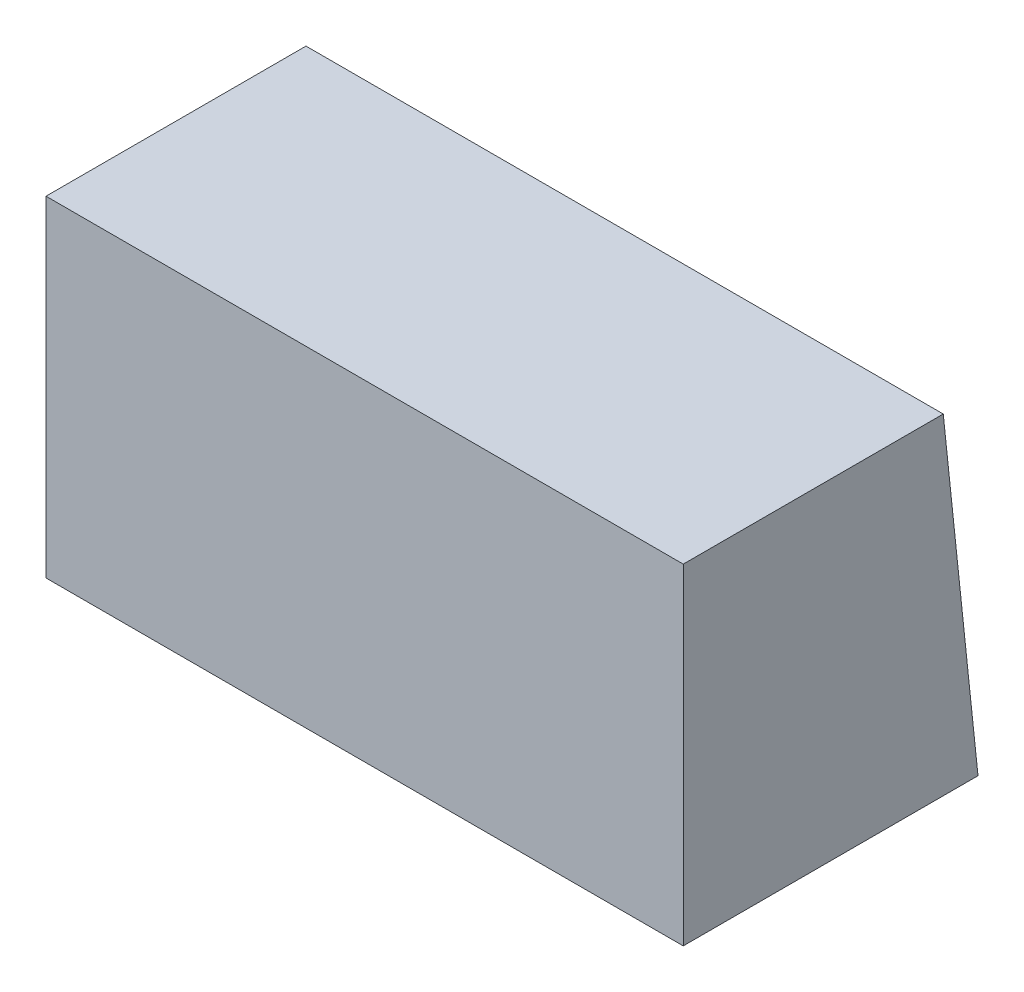
ISO-10303-21;
HEADER;
FILE_DESCRIPTION(('STEP AP214'),'2;1');
FILE_NAME('part.step','',(''),(''),'','','');
FILE_SCHEMA(('AUTOMOTIVE_DESIGN { 1 0 10303 214 1 1 1 1 }'));
ENDSEC;
DATA;
#1=APPLICATION_CONTEXT('core data for automotive mechanical design processes');
#2=APPLICATION_PROTOCOL_DEFINITION('international standard','automotive_design',2000,#1);
#3=PRODUCT_CONTEXT('',#1,'mechanical');
#4=PRODUCT('Part','Part','',(#3));
#5=PRODUCT_RELATED_PRODUCT_CATEGORY('part','',(#4));
#6=PRODUCT_DEFINITION_FORMATION('','',#4);
#7=PRODUCT_DEFINITION_CONTEXT('part definition',#1,'design');
#8=PRODUCT_DEFINITION('design','',#6,#7);
#9=PRODUCT_DEFINITION_SHAPE('','',#8);
#10=(LENGTH_UNIT() NAMED_UNIT(*) SI_UNIT(.MILLI.,.METRE.));
#11=(NAMED_UNIT(*) PLANE_ANGLE_UNIT() SI_UNIT($,.RADIAN.));
#12=(NAMED_UNIT(*) SI_UNIT($,.STERADIAN.) SOLID_ANGLE_UNIT());
#13=UNCERTAINTY_MEASURE_WITH_UNIT(LENGTH_MEASURE(1.E-05),#10,'distance_accuracy_value','');
#14=(GEOMETRIC_REPRESENTATION_CONTEXT(3) GLOBAL_UNCERTAINTY_ASSIGNED_CONTEXT((#13)) GLOBAL_UNIT_ASSIGNED_CONTEXT((#10,
#11,#12)) REPRESENTATION_CONTEXT('',''));
#15=CARTESIAN_POINT('',(0.,0.,0.));
#16=DIRECTION('',(0.,0.,1.));
#17=DIRECTION('',(1.,0.,0.));
#18=AXIS2_PLACEMENT_3D('',#15,#16,#17);
#19=CARTESIAN_POINT('',(-57.5,66.7726229351717,58.080972831492));
#20=DIRECTION('',(-1.,0.,0.));
#21=DIRECTION('',(0.,-1.,0.));
#22=AXIS2_PLACEMENT_3D('',#19,#20,#21);
#23=PLANE('',#22);
#24=DIRECTION('',(0.,-1.,0.));
#25=VECTOR('',#24,1.);
#26=CARTESIAN_POINT('',(-57.5,105.801666725908,105.));
#27=LINE('',#26,#25);
#28=CARTESIAN_POINT('',(-57.5,66.7726229351717,105.));
#29=VERTEX_POINT('',#28);
#30=CARTESIAN_POINT('',(-57.5,7.10130921307532,105.));
#31=VERTEX_POINT('',#30);
#32=EDGE_CURVE('E115',#29,#31,#27,.T.);
#33=ORIENTED_EDGE('',*,*,#32,.F.);
#34=DIRECTION('',(0.,0.,1.));
#35=VECTOR('',#34,1.);
#36=CARTESIAN_POINT('',(-57.5,66.7726229351717,58.080972831492));
#37=LINE('',#36,#35);
#38=CARTESIAN_POINT('',(-57.5,66.7726229351717,58.080972831492));
#39=VERTEX_POINT('',#38);
#40=EDGE_CURVE('E83',#39,#29,#37,.T.);
#41=ORIENTED_EDGE('',*,*,#40,.F.);
#42=DIRECTION('',(0.,-0.994521895368273,-0.104528463267654));
#43=VECTOR('',#42,1.);
#44=CARTESIAN_POINT('',(-57.5,66.7726229351717,58.080972831492));
#45=LINE('',#44,#43);
#46=CARTESIAN_POINT('',(-57.5,7.10130921307533,51.8092650354328));
#47=VERTEX_POINT('',#46);
#48=EDGE_CURVE('E110',#39,#47,#45,.T.);
#49=ORIENTED_EDGE('',*,*,#48,.T.);
#50=DIRECTION('',(0.,0.,1.));
#51=VECTOR('',#50,1.);
#52=CARTESIAN_POINT('',(-57.5,7.10130921307533,51.8092650354328));
#53=LINE('',#52,#51);
#54=EDGE_CURVE('E78',#47,#31,#53,.T.);
#55=ORIENTED_EDGE('',*,*,#54,.T.);
#56=EDGE_LOOP('',(#33,#41,#49,#55));
#57=FACE_BOUND('',#56,.T.);
#58=ADVANCED_FACE('F44',(#57),#23,.T.);
#59=CARTESIAN_POINT('',(57.5,66.7726229351717,58.080972831492));
#60=DIRECTION('',(0.,1.,0.));
#61=DIRECTION('',(-1.,0.,0.));
#62=AXIS2_PLACEMENT_3D('',#59,#60,#61);
#63=PLANE('',#62);
#64=DIRECTION('',(-1.,0.,0.));
#65=VECTOR('',#64,1.);
#66=CARTESIAN_POINT('',(-150.,66.7726229351717,105.));
#67=LINE('',#66,#65);
#68=CARTESIAN_POINT('',(57.5,66.7726229351717,105.));
#69=VERTEX_POINT('',#68);
#70=EDGE_CURVE('E48',#69,#29,#67,.T.);
#71=ORIENTED_EDGE('',*,*,#70,.F.);
#72=DIRECTION('',(0.,0.,1.));
#73=VECTOR('',#72,1.);
#74=CARTESIAN_POINT('',(57.5,66.7726229351717,58.080972831492));
#75=LINE('',#74,#73);
#76=CARTESIAN_POINT('',(57.5,66.7726229351717,58.080972831492));
#77=VERTEX_POINT('',#76);
#78=EDGE_CURVE('E11',#77,#69,#75,.T.);
#79=ORIENTED_EDGE('',*,*,#78,.F.);
#80=DIRECTION('',(-1.,0.,0.));
#81=VECTOR('',#80,1.);
#82=CARTESIAN_POINT('',(57.5,66.7726229351717,58.080972831492));
#83=LINE('',#82,#81);
#84=EDGE_CURVE('E55',#77,#39,#83,.T.);
#85=ORIENTED_EDGE('',*,*,#84,.T.);
#86=ORIENTED_EDGE('',*,*,#40,.T.);
#87=EDGE_LOOP('',(#71,#79,#85,#86));
#88=FACE_BOUND('',#87,.T.);
#89=ADVANCED_FACE('F126',(#88),#63,.T.);
#90=CARTESIAN_POINT('',(0.,-5.30828562465272,50.5049640600565));
#91=DIRECTION('',(0.,-0.104528463267654,0.994521895368273));
#92=DIRECTION('',(0.,-0.994521895368273,-0.104528463267654));
#93=AXIS2_PLACEMENT_3D('',#90,#91,#92);
#94=PLANE('',#93);
#95=ORIENTED_EDGE('',*,*,#84,.F.);
#96=DIRECTION('',(0.,0.994521895368273,0.104528463267654));
#97=VECTOR('',#96,1.);
#98=CARTESIAN_POINT('',(57.5,7.10130921307533,51.8092650354328));
#99=LINE('',#98,#97);
#100=CARTESIAN_POINT('',(57.5,7.10130921307533,51.8092650354328));
#101=VERTEX_POINT('',#100);
#102=EDGE_CURVE('E96',#101,#77,#99,.T.);
#103=ORIENTED_EDGE('',*,*,#102,.F.);
#104=DIRECTION('',(1.,0.,0.));
#105=VECTOR('',#104,1.);
#106=CARTESIAN_POINT('',(-57.5,7.10130921307533,51.8092650354328));
#107=LINE('',#106,#105);
#108=EDGE_CURVE('E105',#47,#101,#107,.T.);
#109=ORIENTED_EDGE('',*,*,#108,.F.);
#110=ORIENTED_EDGE('',*,*,#48,.F.);
#111=EDGE_LOOP('',(#95,#103,#109,#110));
#112=FACE_BOUND('',#111,.T.);
#113=ADVANCED_FACE('F103',(#112),#94,.F.);
#114=CARTESIAN_POINT('',(-57.5,7.10130921307533,51.8092650354328));
#115=DIRECTION('',(0.,-1.,0.));
#116=DIRECTION('',(0.,0.,-1.));
#117=AXIS2_PLACEMENT_3D('',#114,#115,#116);
#118=PLANE('',#117);
#119=DIRECTION('',(1.,0.,0.));
#120=VECTOR('',#119,1.);
#121=CARTESIAN_POINT('',(-150.,7.10130921307532,105.));
#122=LINE('',#121,#120);
#123=CARTESIAN_POINT('',(57.5,7.10130921307532,105.));
#124=VERTEX_POINT('',#123);
#125=EDGE_CURVE('E120',#31,#124,#122,.T.);
#126=ORIENTED_EDGE('',*,*,#125,.F.);
#127=ORIENTED_EDGE('',*,*,#54,.F.);
#128=ORIENTED_EDGE('',*,*,#108,.T.);
#129=DIRECTION('',(0.,0.,1.));
#130=VECTOR('',#129,1.);
#131=CARTESIAN_POINT('',(57.5,7.10130921307533,51.8092650354328));
#132=LINE('',#131,#130);
#133=EDGE_CURVE('E93',#101,#124,#132,.T.);
#134=ORIENTED_EDGE('',*,*,#133,.T.);
#135=EDGE_LOOP('',(#126,#127,#128,#134));
#136=FACE_BOUND('',#135,.T.);
#137=ADVANCED_FACE('F108',(#136),#118,.T.);
#138=CARTESIAN_POINT('',(57.5,7.10130921307533,51.8092650354328));
#139=DIRECTION('',(1.,0.,0.));
#140=DIRECTION('',(0.,1.,0.));
#141=AXIS2_PLACEMENT_3D('',#138,#139,#140);
#142=PLANE('',#141);
#143=DIRECTION('',(0.,1.,0.));
#144=VECTOR('',#143,1.);
#145=CARTESIAN_POINT('',(57.5,105.801666725908,105.));
#146=LINE('',#145,#144);
#147=EDGE_CURVE('E98',#124,#69,#146,.T.);
#148=ORIENTED_EDGE('',*,*,#147,.F.);
#149=ORIENTED_EDGE('',*,*,#133,.F.);
#150=ORIENTED_EDGE('',*,*,#102,.T.);
#151=ORIENTED_EDGE('',*,*,#78,.T.);
#152=EDGE_LOOP('',(#148,#149,#150,#151));
#153=FACE_BOUND('',#152,.T.);
#154=ADVANCED_FACE('F95',(#153),#142,.T.);
#155=CARTESIAN_POINT('',(-150.,105.801666725908,105.));
#156=DIRECTION('',(0.,0.,1.));
#157=DIRECTION('',(1.,0.,0.));
#158=AXIS2_PLACEMENT_3D('',#155,#156,#157);
#159=PLANE('',#158);
#160=ORIENTED_EDGE('',*,*,#147,.T.);
#161=ORIENTED_EDGE('',*,*,#70,.T.);
#162=ORIENTED_EDGE('',*,*,#32,.T.);
#163=ORIENTED_EDGE('',*,*,#125,.T.);
#164=EDGE_LOOP('',(#160,#161,#162,#163));
#165=FACE_BOUND('',#164,.T.);
#166=ADVANCED_FACE('F46',(#165),#159,.T.);
#167=CLOSED_SHELL('',(#58,#89,#113,#137,#154,#166));
#168=MANIFOLD_SOLID_BREP('B2',#167);
#169=ADVANCED_BREP_SHAPE_REPRESENTATION('',(#18,#168),#14);
#170=SHAPE_DEFINITION_REPRESENTATION(#9,#169);
ENDSEC;
END-ISO-10303-21;
